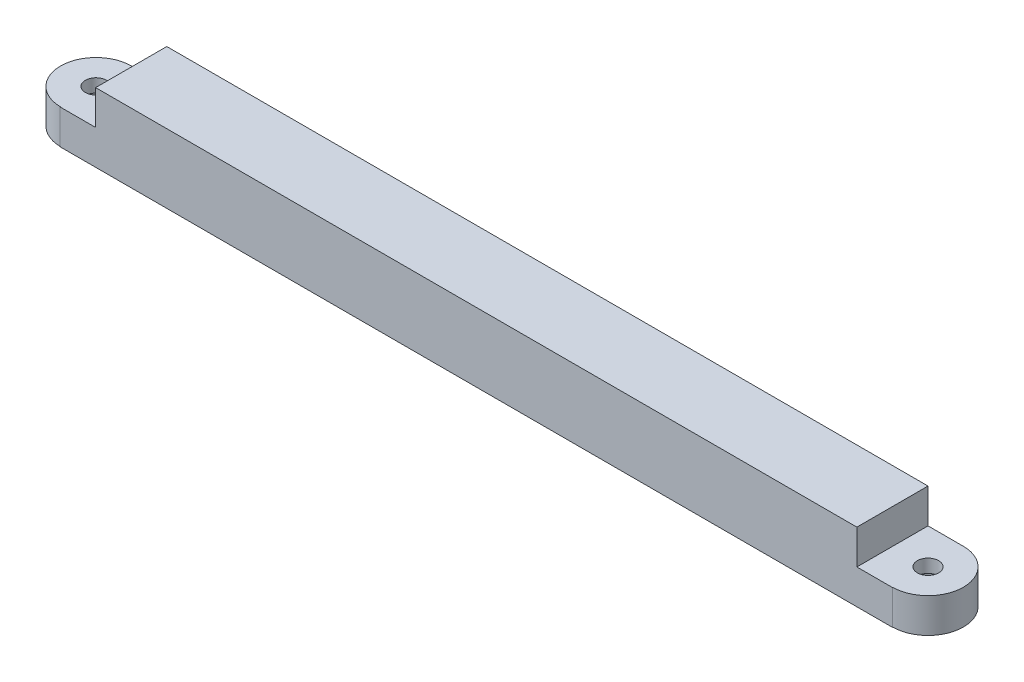
ISO-10303-21;
HEADER;
FILE_DESCRIPTION(('STEP AP214'),'2;1');
FILE_NAME('part.step','',(''),(''),'','','');
FILE_SCHEMA(('AUTOMOTIVE_DESIGN { 1 0 10303 214 1 1 1 1 }'));
ENDSEC;
DATA;
#1=APPLICATION_CONTEXT('core data for automotive mechanical design processes');
#2=APPLICATION_PROTOCOL_DEFINITION('international standard','automotive_design',2000,#1);
#3=PRODUCT_CONTEXT('',#1,'mechanical');
#4=PRODUCT('Part','Part','',(#3));
#5=PRODUCT_RELATED_PRODUCT_CATEGORY('part','',(#4));
#6=PRODUCT_DEFINITION_FORMATION('','',#4);
#7=PRODUCT_DEFINITION_CONTEXT('part definition',#1,'design');
#8=PRODUCT_DEFINITION('design','',#6,#7);
#9=PRODUCT_DEFINITION_SHAPE('','',#8);
#10=(LENGTH_UNIT() NAMED_UNIT(*) SI_UNIT(.MILLI.,.METRE.));
#11=(NAMED_UNIT(*) PLANE_ANGLE_UNIT() SI_UNIT($,.RADIAN.));
#12=(NAMED_UNIT(*) SI_UNIT($,.STERADIAN.) SOLID_ANGLE_UNIT());
#13=UNCERTAINTY_MEASURE_WITH_UNIT(LENGTH_MEASURE(1.E-05),#10,'distance_accuracy_value','');
#14=(GEOMETRIC_REPRESENTATION_CONTEXT(3) GLOBAL_UNCERTAINTY_ASSIGNED_CONTEXT((#13)) GLOBAL_UNIT_ASSIGNED_CONTEXT((#10,
#11,#12)) REPRESENTATION_CONTEXT('',''));
#15=CARTESIAN_POINT('',(0.,0.,0.));
#16=DIRECTION('',(0.,0.,1.));
#17=DIRECTION('',(1.,0.,0.));
#18=AXIS2_PLACEMENT_3D('',#15,#16,#17);
#19=CARTESIAN_POINT('',(-58.75,9.75,0.));
#20=DIRECTION('',(0.,-1.,0.));
#21=DIRECTION('',(0.,0.,-1.));
#22=AXIS2_PLACEMENT_3D('',#19,#20,#21);
#23=CYLINDRICAL_SURFACE('',#22,1.5);
#24=CARTESIAN_POINT('',(-58.75,4.875,0.));
#25=DIRECTION('',(0.,-1.,0.));
#26=DIRECTION('',(0.,0.,1.));
#27=AXIS2_PLACEMENT_3D('',#24,#25,#26);
#28=CIRCLE('',#27,1.5);
#29=CARTESIAN_POINT('',(-58.75,4.875,1.5));
#30=VERTEX_POINT('',#29);
#31=EDGE_CURVE('E124',#30,#30,#28,.F.);
#32=ORIENTED_EDGE('',*,*,#31,.T.);
#33=EDGE_LOOP('',(#32));
#34=FACE_BOUND('',#33,.T.);
#35=CARTESIAN_POINT('',(-58.75,3.,0.));
#36=DIRECTION('',(0.,-1.,0.));
#37=DIRECTION('',(0.,0.,-1.));
#38=AXIS2_PLACEMENT_3D('',#35,#36,#37);
#39=CIRCLE('',#38,1.5);
#40=CARTESIAN_POINT('',(-58.75,3.,-1.5));
#41=VERTEX_POINT('',#40);
#42=EDGE_CURVE('E39',#41,#41,#39,.F.);
#43=ORIENTED_EDGE('',*,*,#42,.F.);
#44=EDGE_LOOP('',(#43));
#45=FACE_BOUND('',#44,.T.);
#46=ADVANCED_FACE('F35',(#34,#45),#23,.F.);
#47=CARTESIAN_POINT('',(58.75,9.75,0.));
#48=DIRECTION('',(0.,-1.,0.));
#49=DIRECTION('',(0.,0.,-1.));
#50=AXIS2_PLACEMENT_3D('',#47,#48,#49);
#51=CYLINDRICAL_SURFACE('',#50,1.5);
#52=CARTESIAN_POINT('',(58.75,4.875,0.));
#53=DIRECTION('',(0.,1.,0.));
#54=DIRECTION('',(0.,0.,1.));
#55=AXIS2_PLACEMENT_3D('',#52,#53,#54);
#56=CIRCLE('',#55,1.5);
#57=CARTESIAN_POINT('',(58.75,4.875,1.5));
#58=VERTEX_POINT('',#57);
#59=EDGE_CURVE('E160',#58,#58,#56,.F.);
#60=ORIENTED_EDGE('',*,*,#59,.F.);
#61=EDGE_LOOP('',(#60));
#62=FACE_BOUND('',#61,.T.);
#63=CARTESIAN_POINT('',(58.75,3.,0.));
#64=DIRECTION('',(0.,-1.,0.));
#65=DIRECTION('',(0.,0.,-1.));
#66=AXIS2_PLACEMENT_3D('',#63,#64,#65);
#67=CIRCLE('',#66,1.5);
#68=CARTESIAN_POINT('',(58.75,3.,-1.5));
#69=VERTEX_POINT('',#68);
#70=EDGE_CURVE('E197',#69,#69,#67,.T.);
#71=ORIENTED_EDGE('',*,*,#70,.T.);
#72=EDGE_LOOP('',(#71));
#73=FACE_BOUND('',#72,.T.);
#74=ADVANCED_FACE('F37',(#62,#73),#51,.F.);
#75=CARTESIAN_POINT('',(-58.75,9.75,0.));
#76=DIRECTION('',(-1.,0.,0.));
#77=DIRECTION('',(0.,0.,1.));
#78=AXIS2_PLACEMENT_3D('',#75,#76,#77);
#79=PLANE('',#78);
#80=DIRECTION('',(0.,-1.,0.));
#81=VECTOR('',#80,1.);
#82=CARTESIAN_POINT('',(-58.75,9.75,5.04902762084879));
#83=LINE('',#82,#81);
#84=CARTESIAN_POINT('',(-58.75,4.875,5.04902762084879));
#85=VERTEX_POINT('',#84);
#86=CARTESIAN_POINT('',(-58.75,0.,5.04902762084879));
#87=VERTEX_POINT('',#86);
#88=EDGE_CURVE('E177',#85,#87,#83,.T.);
#89=ORIENTED_EDGE('',*,*,#88,.F.);
#90=DIRECTION('',(0.,0.,-1.));
#91=VECTOR('',#90,1.);
#92=CARTESIAN_POINT('',(-58.75,4.875,0.));
#93=LINE('',#92,#91);
#94=CARTESIAN_POINT('',(-58.75,4.875,5.));
#95=VERTEX_POINT('',#94);
#96=EDGE_CURVE('E137',#85,#95,#93,.T.);
#97=ORIENTED_EDGE('',*,*,#96,.T.);
#98=DIRECTION('',(0.,-1.,0.));
#99=VECTOR('',#98,1.);
#100=CARTESIAN_POINT('',(-58.75,9.75,5.));
#101=LINE('',#100,#99);
#102=CARTESIAN_POINT('',(-58.75,0.,5.));
#103=VERTEX_POINT('',#102);
#104=EDGE_CURVE('E174',#95,#103,#101,.T.);
#105=ORIENTED_EDGE('',*,*,#104,.T.);
#106=DIRECTION('',(0.,0.,-1.));
#107=VECTOR('',#106,1.);
#108=CARTESIAN_POINT('',(-58.75,0.,0.));
#109=LINE('',#108,#107);
#110=EDGE_CURVE('E166',#87,#103,#109,.T.);
#111=ORIENTED_EDGE('',*,*,#110,.F.);
#112=EDGE_LOOP('',(#89,#97,#105,#111));
#113=FACE_BOUND('',#112,.T.);
#114=ADVANCED_FACE('F239',(#113),#79,.T.);
#115=CARTESIAN_POINT('',(-58.75,9.75,0.));
#116=DIRECTION('',(0.,-1.,0.));
#117=DIRECTION('',(0.,0.,-1.));
#118=AXIS2_PLACEMENT_3D('',#115,#116,#117);
#119=CYLINDRICAL_SURFACE('',#118,5.);
#120=ORIENTED_EDGE('',*,*,#104,.F.);
#121=CARTESIAN_POINT('',(-58.75,4.875,0.));
#122=DIRECTION('',(0.,-1.,0.));
#123=DIRECTION('',(0.,0.,1.));
#124=AXIS2_PLACEMENT_3D('',#121,#122,#123);
#125=CIRCLE('',#124,5.);
#126=CARTESIAN_POINT('',(-58.75,4.875,-5.00000000000001));
#127=VERTEX_POINT('',#126);
#128=EDGE_CURVE('E135',#95,#127,#125,.T.);
#129=ORIENTED_EDGE('',*,*,#128,.T.);
#130=DIRECTION('',(0.,-1.,0.));
#131=VECTOR('',#130,1.);
#132=CARTESIAN_POINT('',(-58.75,9.75,-5.00000000000001));
#133=LINE('',#132,#131);
#134=CARTESIAN_POINT('',(-58.75,0.,-5.00000000000001));
#135=VERTEX_POINT('',#134);
#136=EDGE_CURVE('E134',#127,#135,#133,.T.);
#137=ORIENTED_EDGE('',*,*,#136,.T.);
#138=CARTESIAN_POINT('',(-58.75,0.,0.));
#139=DIRECTION('',(0.,-1.,0.));
#140=DIRECTION('',(0.,0.,1.));
#141=AXIS2_PLACEMENT_3D('',#138,#139,#140);
#142=CIRCLE('',#141,5.);
#143=EDGE_CURVE('E171',#103,#135,#142,.T.);
#144=ORIENTED_EDGE('',*,*,#143,.F.);
#145=EDGE_LOOP('',(#120,#129,#137,#144));
#146=FACE_BOUND('',#145,.T.);
#147=ADVANCED_FACE('F243',(#146),#119,.T.);
#148=CARTESIAN_POINT('',(58.75,9.75,0.));
#149=DIRECTION('',(-1.,0.,0.));
#150=DIRECTION('',(0.,0.,1.));
#151=AXIS2_PLACEMENT_3D('',#148,#149,#150);
#152=PLANE('',#151);
#153=DIRECTION('',(0.,0.,-1.));
#154=VECTOR('',#153,1.);
#155=CARTESIAN_POINT('',(58.75,4.875,0.));
#156=LINE('',#155,#154);
#157=CARTESIAN_POINT('',(58.75,4.875,5.04902762084879));
#158=VERTEX_POINT('',#157);
#159=CARTESIAN_POINT('',(58.75,4.875,5.));
#160=VERTEX_POINT('',#159);
#161=EDGE_CURVE('E153',#158,#160,#156,.T.);
#162=ORIENTED_EDGE('',*,*,#161,.F.);
#163=DIRECTION('',(0.,-1.,0.));
#164=VECTOR('',#163,1.);
#165=CARTESIAN_POINT('',(58.75,9.75,5.04902762084879));
#166=LINE('',#165,#164);
#167=CARTESIAN_POINT('',(58.75,0.,5.04902762084879));
#168=VERTEX_POINT('',#167);
#169=EDGE_CURVE('E186',#158,#168,#166,.T.);
#170=ORIENTED_EDGE('',*,*,#169,.T.);
#171=DIRECTION('',(0.,0.,-1.));
#172=VECTOR('',#171,1.);
#173=CARTESIAN_POINT('',(58.75,0.,0.));
#174=LINE('',#173,#172);
#175=CARTESIAN_POINT('',(58.75,0.,5.));
#176=VERTEX_POINT('',#175);
#177=EDGE_CURVE('E179',#168,#176,#174,.T.);
#178=ORIENTED_EDGE('',*,*,#177,.T.);
#179=DIRECTION('',(0.,-1.,0.));
#180=VECTOR('',#179,1.);
#181=CARTESIAN_POINT('',(58.75,9.75,5.));
#182=LINE('',#181,#180);
#183=EDGE_CURVE('E11',#160,#176,#182,.T.);
#184=ORIENTED_EDGE('',*,*,#183,.F.);
#185=EDGE_LOOP('',(#162,#170,#178,#184));
#186=FACE_BOUND('',#185,.T.);
#187=ADVANCED_FACE('F250',(#186),#152,.F.);
#188=CARTESIAN_POINT('',(58.75,9.75,0.));
#189=DIRECTION('',(0.,-1.,0.));
#190=DIRECTION('',(0.,0.,-1.));
#191=AXIS2_PLACEMENT_3D('',#188,#189,#190);
#192=CYLINDRICAL_SURFACE('',#191,5.);
#193=CARTESIAN_POINT('',(58.75,4.875,0.));
#194=DIRECTION('',(0.,1.,0.));
#195=DIRECTION('',(0.,0.,1.));
#196=AXIS2_PLACEMENT_3D('',#193,#194,#195);
#197=CIRCLE('',#196,5.);
#198=CARTESIAN_POINT('',(58.75,4.875,-5.00000000000001));
#199=VERTEX_POINT('',#198);
#200=EDGE_CURVE('E155',#160,#199,#197,.T.);
#201=ORIENTED_EDGE('',*,*,#200,.F.);
#202=ORIENTED_EDGE('',*,*,#183,.T.);
#203=CARTESIAN_POINT('',(58.75,0.,0.));
#204=DIRECTION('',(0.,1.,0.));
#205=DIRECTION('',(0.,0.,1.));
#206=AXIS2_PLACEMENT_3D('',#203,#204,#205);
#207=CIRCLE('',#206,5.);
#208=CARTESIAN_POINT('',(58.75,0.,-5.00000000000001));
#209=VERTEX_POINT('',#208);
#210=EDGE_CURVE('E189',#176,#209,#207,.T.);
#211=ORIENTED_EDGE('',*,*,#210,.T.);
#212=DIRECTION('',(0.,-1.,0.));
#213=VECTOR('',#212,1.);
#214=CARTESIAN_POINT('',(58.75,9.75,-5.00000000000001));
#215=LINE('',#214,#213);
#216=EDGE_CURVE('E44',#199,#209,#215,.T.);
#217=ORIENTED_EDGE('',*,*,#216,.F.);
#218=EDGE_LOOP('',(#201,#202,#211,#217));
#219=FACE_BOUND('',#218,.T.);
#220=ADVANCED_FACE('F248',(#219),#192,.T.);
#221=CARTESIAN_POINT('',(0.,9.75,-5.));
#222=DIRECTION('',(0.,0.,1.));
#223=DIRECTION('',(1.,0.,0.));
#224=AXIS2_PLACEMENT_3D('',#221,#222,#223);
#225=PLANE('',#224);
#226=DIRECTION('',(1.,0.,0.));
#227=VECTOR('',#226,1.);
#228=CARTESIAN_POINT('',(0.,4.875,-5.));
#229=LINE('',#228,#227);
#230=CARTESIAN_POINT('',(-53.75,4.875,-5.00000000000001));
#231=VERTEX_POINT('',#230);
#232=EDGE_CURVE('E52',#127,#231,#229,.T.);
#233=ORIENTED_EDGE('',*,*,#232,.T.);
#234=DIRECTION('',(0.,1.,0.));
#235=VECTOR('',#234,1.);
#236=CARTESIAN_POINT('',(-53.75,4.875,-5.00000000000001));
#237=LINE('',#236,#235);
#238=CARTESIAN_POINT('',(-53.75,9.75,-5.00000000000001));
#239=VERTEX_POINT('',#238);
#240=EDGE_CURVE('E114',#231,#239,#237,.T.);
#241=ORIENTED_EDGE('',*,*,#240,.T.);
#242=DIRECTION('',(-1.,0.,0.));
#243=VECTOR('',#242,1.);
#244=CARTESIAN_POINT('',(0.,9.75,-5.));
#245=LINE('',#244,#243);
#246=CARTESIAN_POINT('',(53.75,9.75,-5.00000000000001));
#247=VERTEX_POINT('',#246);
#248=EDGE_CURVE('E180',#247,#239,#245,.T.);
#249=ORIENTED_EDGE('',*,*,#248,.F.);
#250=DIRECTION('',(0.,1.,0.));
#251=VECTOR('',#250,1.);
#252=CARTESIAN_POINT('',(53.75,4.875,-5.00000000000001));
#253=LINE('',#252,#251);
#254=CARTESIAN_POINT('',(53.75,4.875,-5.00000000000001));
#255=VERTEX_POINT('',#254);
#256=EDGE_CURVE('E60',#255,#247,#253,.T.);
#257=ORIENTED_EDGE('',*,*,#256,.F.);
#258=DIRECTION('',(-1.,0.,0.));
#259=VECTOR('',#258,1.);
#260=CARTESIAN_POINT('',(0.,4.875,-5.));
#261=LINE('',#260,#259);
#262=EDGE_CURVE('E157',#199,#255,#261,.T.);
#263=ORIENTED_EDGE('',*,*,#262,.F.);
#264=ORIENTED_EDGE('',*,*,#216,.T.);
#265=DIRECTION('',(-1.,0.,0.));
#266=VECTOR('',#265,1.);
#267=CARTESIAN_POINT('',(0.,0.,-5.));
#268=LINE('',#267,#266);
#269=EDGE_CURVE('E192',#209,#135,#268,.T.);
#270=ORIENTED_EDGE('',*,*,#269,.T.);
#271=ORIENTED_EDGE('',*,*,#136,.F.);
#272=EDGE_LOOP('',(#233,#241,#249,#257,#263,#264,#270,#271));
#273=FACE_BOUND('',#272,.T.);
#274=ADVANCED_FACE('F132',(#273),#225,.F.);
#275=CARTESIAN_POINT('',(0.,9.75,5.0490276208488));
#276=DIRECTION('',(0.,0.,1.));
#277=DIRECTION('',(1.,0.,0.));
#278=AXIS2_PLACEMENT_3D('',#275,#276,#277);
#279=PLANE('',#278);
#280=DIRECTION('',(0.,1.,0.));
#281=VECTOR('',#280,1.);
#282=CARTESIAN_POINT('',(-53.75,4.875,5.04902762084879));
#283=LINE('',#282,#281);
#284=CARTESIAN_POINT('',(-53.75,4.875,5.04902762084879));
#285=VERTEX_POINT('',#284);
#286=CARTESIAN_POINT('',(-53.75,9.75,5.04902762084879));
#287=VERTEX_POINT('',#286);
#288=EDGE_CURVE('E123',#285,#287,#283,.T.);
#289=ORIENTED_EDGE('',*,*,#288,.F.);
#290=DIRECTION('',(-1.,0.,0.));
#291=VECTOR('',#290,1.);
#292=CARTESIAN_POINT('',(0.,4.875,5.0490276208488));
#293=LINE('',#292,#291);
#294=EDGE_CURVE('E129',#285,#85,#293,.T.);
#295=ORIENTED_EDGE('',*,*,#294,.T.);
#296=ORIENTED_EDGE('',*,*,#88,.T.);
#297=DIRECTION('',(-1.,0.,0.));
#298=VECTOR('',#297,1.);
#299=CARTESIAN_POINT('',(0.,0.,5.0490276208488));
#300=LINE('',#299,#298);
#301=EDGE_CURVE('E183',#168,#87,#300,.T.);
#302=ORIENTED_EDGE('',*,*,#301,.F.);
#303=ORIENTED_EDGE('',*,*,#169,.F.);
#304=DIRECTION('',(1.,0.,0.));
#305=VECTOR('',#304,1.);
#306=CARTESIAN_POINT('',(0.,4.875,5.0490276208488));
#307=LINE('',#306,#305);
#308=CARTESIAN_POINT('',(53.75,4.875,5.04902762084879));
#309=VERTEX_POINT('',#308);
#310=EDGE_CURVE('E151',#309,#158,#307,.T.);
#311=ORIENTED_EDGE('',*,*,#310,.F.);
#312=DIRECTION('',(0.,1.,0.));
#313=VECTOR('',#312,1.);
#314=CARTESIAN_POINT('',(53.75,4.875,5.04902762084879));
#315=LINE('',#314,#313);
#316=CARTESIAN_POINT('',(53.75,9.75,5.04902762084879));
#317=VERTEX_POINT('',#316);
#318=EDGE_CURVE('E163',#309,#317,#315,.T.);
#319=ORIENTED_EDGE('',*,*,#318,.T.);
#320=DIRECTION('',(-1.,0.,0.));
#321=VECTOR('',#320,1.);
#322=CARTESIAN_POINT('',(0.,9.75,5.0490276208488));
#323=LINE('',#322,#321);
#324=EDGE_CURVE('E182',#317,#287,#323,.T.);
#325=ORIENTED_EDGE('',*,*,#324,.T.);
#326=EDGE_LOOP('',(#289,#295,#296,#302,#303,#311,#319,#325));
#327=FACE_BOUND('',#326,.T.);
#328=ADVANCED_FACE('F235',(#327),#279,.T.);
#329=CARTESIAN_POINT('',(0.,9.75,0.));
#330=DIRECTION('',(0.,1.,0.));
#331=DIRECTION('',(0.,0.,1.));
#332=AXIS2_PLACEMENT_3D('',#329,#330,#331);
#333=PLANE('',#332);
#334=DIRECTION('',(0.,0.,-1.));
#335=VECTOR('',#334,1.);
#336=CARTESIAN_POINT('',(-53.75,9.75,0.));
#337=LINE('',#336,#335);
#338=EDGE_CURVE('E119',#287,#239,#337,.T.);
#339=ORIENTED_EDGE('',*,*,#338,.F.);
#340=ORIENTED_EDGE('',*,*,#324,.F.);
#341=DIRECTION('',(0.,0.,-1.));
#342=VECTOR('',#341,1.);
#343=CARTESIAN_POINT('',(53.75,9.75,0.));
#344=LINE('',#343,#342);
#345=EDGE_CURVE('E147',#317,#247,#344,.T.);
#346=ORIENTED_EDGE('',*,*,#345,.T.);
#347=ORIENTED_EDGE('',*,*,#248,.T.);
#348=EDGE_LOOP('',(#339,#340,#346,#347));
#349=FACE_BOUND('',#348,.T.);
#350=ADVANCED_FACE('F223',(#349),#333,.T.);
#351=CARTESIAN_POINT('',(0.,0.,0.));
#352=DIRECTION('',(0.,1.,0.));
#353=DIRECTION('',(0.,0.,1.));
#354=AXIS2_PLACEMENT_3D('',#351,#352,#353);
#355=PLANE('',#354);
#356=CARTESIAN_POINT('',(-58.75,0.,0.));
#357=DIRECTION('',(0.,-1.,0.));
#358=DIRECTION('',(0.,0.,-1.));
#359=AXIS2_PLACEMENT_3D('',#356,#357,#358);
#360=CIRCLE('',#359,2.825);
#361=CARTESIAN_POINT('',(-58.75,0.,-2.825));
#362=VERTEX_POINT('',#361);
#363=EDGE_CURVE('E204',#362,#362,#360,.T.);
#364=ORIENTED_EDGE('',*,*,#363,.F.);
#365=EDGE_LOOP('',(#364));
#366=FACE_BOUND('',#365,.T.);
#367=CARTESIAN_POINT('',(58.75,0.,0.));
#368=DIRECTION('',(0.,-1.,0.));
#369=DIRECTION('',(0.,0.,-1.));
#370=AXIS2_PLACEMENT_3D('',#367,#368,#369);
#371=CIRCLE('',#370,2.825);
#372=CARTESIAN_POINT('',(58.75,0.,-2.825));
#373=VERTEX_POINT('',#372);
#374=EDGE_CURVE('E213',#373,#373,#371,.T.);
#375=ORIENTED_EDGE('',*,*,#374,.F.);
#376=EDGE_LOOP('',(#375));
#377=FACE_BOUND('',#376,.T.);
#378=ORIENTED_EDGE('',*,*,#177,.F.);
#379=ORIENTED_EDGE('',*,*,#301,.T.);
#380=ORIENTED_EDGE('',*,*,#110,.T.);
#381=ORIENTED_EDGE('',*,*,#143,.T.);
#382=ORIENTED_EDGE('',*,*,#269,.F.);
#383=ORIENTED_EDGE('',*,*,#210,.F.);
#384=EDGE_LOOP('',(#378,#379,#380,#381,#382,#383));
#385=FACE_BOUND('',#384,.T.);
#386=ADVANCED_FACE('F219',(#366,#377,#385),#355,.F.);
#387=CARTESIAN_POINT('',(53.75,4.875,0.));
#388=DIRECTION('',(1.,0.,0.));
#389=DIRECTION('',(0.,0.,-1.));
#390=AXIS2_PLACEMENT_3D('',#387,#388,#389);
#391=PLANE('',#390);
#392=ORIENTED_EDGE('',*,*,#345,.F.);
#393=ORIENTED_EDGE('',*,*,#318,.F.);
#394=DIRECTION('',(0.,0.,-1.));
#395=VECTOR('',#394,1.);
#396=CARTESIAN_POINT('',(53.75,4.875,0.));
#397=LINE('',#396,#395);
#398=EDGE_CURVE('E149',#309,#255,#397,.T.);
#399=ORIENTED_EDGE('',*,*,#398,.T.);
#400=ORIENTED_EDGE('',*,*,#256,.T.);
#401=EDGE_LOOP('',(#392,#393,#399,#400));
#402=FACE_BOUND('',#401,.T.);
#403=ADVANCED_FACE('F222',(#402),#391,.T.);
#404=CARTESIAN_POINT('',(0.,4.875,0.));
#405=DIRECTION('',(0.,1.,0.));
#406=DIRECTION('',(0.,0.,1.));
#407=AXIS2_PLACEMENT_3D('',#404,#405,#406);
#408=PLANE('',#407);
#409=ORIENTED_EDGE('',*,*,#398,.F.);
#410=ORIENTED_EDGE('',*,*,#310,.T.);
#411=ORIENTED_EDGE('',*,*,#161,.T.);
#412=ORIENTED_EDGE('',*,*,#200,.T.);
#413=ORIENTED_EDGE('',*,*,#262,.T.);
#414=EDGE_LOOP('',(#409,#410,#411,#412,#413));
#415=FACE_BOUND('',#414,.T.);
#416=ORIENTED_EDGE('',*,*,#59,.T.);
#417=EDGE_LOOP('',(#416));
#418=FACE_BOUND('',#417,.T.);
#419=ADVANCED_FACE('F253',(#415,#418),#408,.T.);
#420=CARTESIAN_POINT('',(-53.75,4.875,0.));
#421=DIRECTION('',(1.,0.,0.));
#422=DIRECTION('',(0.,0.,-1.));
#423=AXIS2_PLACEMENT_3D('',#420,#421,#422);
#424=PLANE('',#423);
#425=ORIENTED_EDGE('',*,*,#338,.T.);
#426=ORIENTED_EDGE('',*,*,#240,.F.);
#427=DIRECTION('',(0.,0.,-1.));
#428=VECTOR('',#427,1.);
#429=CARTESIAN_POINT('',(-53.75,4.875,0.));
#430=LINE('',#429,#428);
#431=EDGE_CURVE('E116',#285,#231,#430,.T.);
#432=ORIENTED_EDGE('',*,*,#431,.F.);
#433=ORIENTED_EDGE('',*,*,#288,.T.);
#434=EDGE_LOOP('',(#425,#426,#432,#433));
#435=FACE_BOUND('',#434,.T.);
#436=ADVANCED_FACE('F115',(#435),#424,.F.);
#437=CARTESIAN_POINT('',(0.,4.875,0.));
#438=DIRECTION('',(0.,1.,0.));
#439=DIRECTION('',(0.,0.,1.));
#440=AXIS2_PLACEMENT_3D('',#437,#438,#439);
#441=PLANE('',#440);
#442=ORIENTED_EDGE('',*,*,#431,.T.);
#443=ORIENTED_EDGE('',*,*,#232,.F.);
#444=ORIENTED_EDGE('',*,*,#128,.F.);
#445=ORIENTED_EDGE('',*,*,#96,.F.);
#446=ORIENTED_EDGE('',*,*,#294,.F.);
#447=EDGE_LOOP('',(#442,#443,#444,#445,#446));
#448=FACE_BOUND('',#447,.T.);
#449=ORIENTED_EDGE('',*,*,#31,.F.);
#450=EDGE_LOOP('',(#449));
#451=FACE_BOUND('',#450,.T.);
#452=ADVANCED_FACE('F126',(#448,#451),#441,.T.);
#453=CARTESIAN_POINT('',(58.75,3.,0.));
#454=DIRECTION('',(0.,-1.,0.));
#455=DIRECTION('',(0.,0.,-1.));
#456=AXIS2_PLACEMENT_3D('',#453,#454,#455);
#457=CYLINDRICAL_SURFACE('',#456,2.825);
#458=CARTESIAN_POINT('',(58.75,3.,0.));
#459=DIRECTION('',(0.,-1.,0.));
#460=DIRECTION('',(0.,0.,-1.));
#461=AXIS2_PLACEMENT_3D('',#458,#459,#460);
#462=CIRCLE('',#461,2.825);
#463=CARTESIAN_POINT('',(58.75,3.,-2.825));
#464=VERTEX_POINT('',#463);
#465=EDGE_CURVE('E209',#464,#464,#462,.T.);
#466=ORIENTED_EDGE('',*,*,#465,.F.);
#467=EDGE_LOOP('',(#466));
#468=FACE_BOUND('',#467,.T.);
#469=ORIENTED_EDGE('',*,*,#374,.T.);
#470=EDGE_LOOP('',(#469));
#471=FACE_BOUND('',#470,.T.);
#472=ADVANCED_FACE('F217',(#468,#471),#457,.F.);
#473=CARTESIAN_POINT('',(58.75,3.,0.));
#474=DIRECTION('',(0.,-1.,0.));
#475=DIRECTION('',(0.,0.,-1.));
#476=AXIS2_PLACEMENT_3D('',#473,#474,#475);
#477=PLANE('',#476);
#478=ORIENTED_EDGE('',*,*,#70,.F.);
#479=EDGE_LOOP('',(#478));
#480=FACE_BOUND('',#479,.T.);
#481=ORIENTED_EDGE('',*,*,#465,.T.);
#482=EDGE_LOOP('',(#481));
#483=FACE_BOUND('',#482,.T.);
#484=ADVANCED_FACE('F357',(#480,#483),#477,.T.);
#485=CARTESIAN_POINT('',(-58.75,3.,0.));
#486=DIRECTION('',(0.,-1.,0.));
#487=DIRECTION('',(0.,0.,-1.));
#488=AXIS2_PLACEMENT_3D('',#485,#486,#487);
#489=PLANE('',#488);
#490=CARTESIAN_POINT('',(-58.75,3.,0.));
#491=DIRECTION('',(0.,-1.,0.));
#492=DIRECTION('',(0.,0.,-1.));
#493=AXIS2_PLACEMENT_3D('',#490,#491,#492);
#494=CIRCLE('',#493,2.825);
#495=CARTESIAN_POINT('',(-58.75,3.,-2.825));
#496=VERTEX_POINT('',#495);
#497=EDGE_CURVE('E199',#496,#496,#494,.T.);
#498=ORIENTED_EDGE('',*,*,#497,.T.);
#499=EDGE_LOOP('',(#498));
#500=FACE_BOUND('',#499,.T.);
#501=ORIENTED_EDGE('',*,*,#42,.T.);
#502=EDGE_LOOP('',(#501));
#503=FACE_BOUND('',#502,.T.);
#504=ADVANCED_FACE('F364',(#500,#503),#489,.T.);
#505=CARTESIAN_POINT('',(-58.75,3.,0.));
#506=DIRECTION('',(0.,-1.,0.));
#507=DIRECTION('',(0.,0.,-1.));
#508=AXIS2_PLACEMENT_3D('',#505,#506,#507);
#509=CYLINDRICAL_SURFACE('',#508,2.825);
#510=ORIENTED_EDGE('',*,*,#497,.F.);
#511=EDGE_LOOP('',(#510));
#512=FACE_BOUND('',#511,.T.);
#513=ORIENTED_EDGE('',*,*,#363,.T.);
#514=EDGE_LOOP('',(#513));
#515=FACE_BOUND('',#514,.T.);
#516=ADVANCED_FACE('F372',(#512,#515),#509,.F.);
#517=CLOSED_SHELL('',(#46,#74,#114,#147,#187,#220,#274,#328,#350,#386,#403,#419,#436,#452,#472,
#484,#504,#516));
#518=MANIFOLD_SOLID_BREP('B2',#517);
#519=ADVANCED_BREP_SHAPE_REPRESENTATION('',(#18,#518),#14);
#520=SHAPE_DEFINITION_REPRESENTATION(#9,#519);
ENDSEC;
END-ISO-10303-21;
